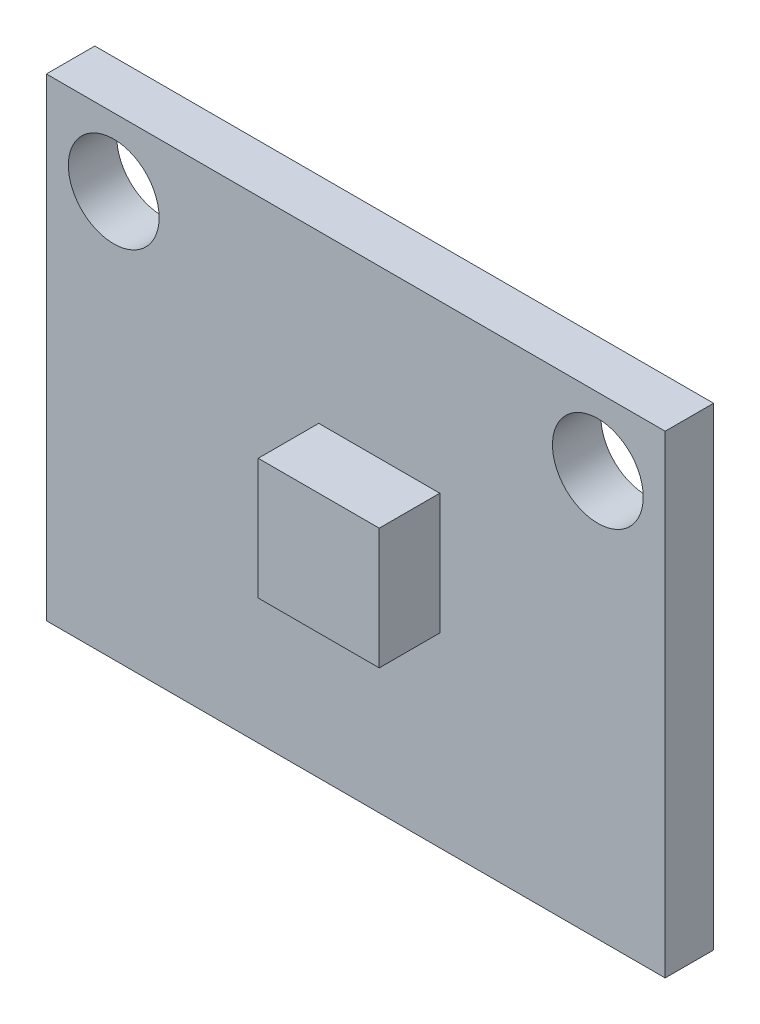
ISO-10303-21;
HEADER;
FILE_DESCRIPTION(('STEP AP214'),'2;1');
FILE_NAME('part.step','',(''),(''),'','','');
FILE_SCHEMA(('AUTOMOTIVE_DESIGN { 1 0 10303 214 1 1 1 1 }'));
ENDSEC;
DATA;
#1=APPLICATION_CONTEXT('core data for automotive mechanical design processes');
#2=APPLICATION_PROTOCOL_DEFINITION('international standard','automotive_design',2000,#1);
#3=PRODUCT_CONTEXT('',#1,'mechanical');
#4=PRODUCT('Part','Part','',(#3));
#5=PRODUCT_RELATED_PRODUCT_CATEGORY('part','',(#4));
#6=PRODUCT_DEFINITION_FORMATION('','',#4);
#7=PRODUCT_DEFINITION_CONTEXT('part definition',#1,'design');
#8=PRODUCT_DEFINITION('design','',#6,#7);
#9=PRODUCT_DEFINITION_SHAPE('','',#8);
#10=(LENGTH_UNIT() NAMED_UNIT(*) SI_UNIT(.MILLI.,.METRE.));
#11=(NAMED_UNIT(*) PLANE_ANGLE_UNIT() SI_UNIT($,.RADIAN.));
#12=(NAMED_UNIT(*) SI_UNIT($,.STERADIAN.) SOLID_ANGLE_UNIT());
#13=UNCERTAINTY_MEASURE_WITH_UNIT(LENGTH_MEASURE(1.E-05),#10,'distance_accuracy_value','');
#14=(GEOMETRIC_REPRESENTATION_CONTEXT(3) GLOBAL_UNCERTAINTY_ASSIGNED_CONTEXT((#13)) GLOBAL_UNIT_ASSIGNED_CONTEXT((#10,
#11,#12)) REPRESENTATION_CONTEXT('',''));
#15=CARTESIAN_POINT('',(0.,0.,0.));
#16=DIRECTION('',(0.,0.,1.));
#17=DIRECTION('',(1.,0.,0.));
#18=AXIS2_PLACEMENT_3D('',#15,#16,#17);
#19=CARTESIAN_POINT('',(-1.22499999999983,2.32500000000008,3.6));
#20=DIRECTION('',(1.,0.,0.));
#21=DIRECTION('',(0.,1.,0.));
#22=AXIS2_PLACEMENT_3D('',#19,#20,#21);
#23=PLANE('',#22);
#24=DIRECTION('',(0.,-1.,0.));
#25=VECTOR('',#24,1.);
#26=CARTESIAN_POINT('',(-1.22499999999983,2.32500000000008,1.6));
#27=LINE('',#26,#25);
#28=CARTESIAN_POINT('',(-1.22499999999983,2.32500000000008,1.6));
#29=VERTEX_POINT('',#28);
#30=CARTESIAN_POINT('',(-1.22499999999983,-1.67499999999992,1.6));
#31=VERTEX_POINT('',#30);
#32=EDGE_CURVE('E115',#29,#31,#27,.T.);
#33=ORIENTED_EDGE('',*,*,#32,.T.);
#34=DIRECTION('',(0.,0.,-1.));
#35=VECTOR('',#34,1.);
#36=CARTESIAN_POINT('',(-1.22499999999983,-1.67499999999992,3.6));
#37=LINE('',#36,#35);
#38=CARTESIAN_POINT('',(-1.22499999999983,-1.67499999999992,3.6));
#39=VERTEX_POINT('',#38);
#40=EDGE_CURVE('E12',#39,#31,#37,.T.);
#41=ORIENTED_EDGE('',*,*,#40,.F.);
#42=DIRECTION('',(0.,-1.,0.));
#43=VECTOR('',#42,1.);
#44=CARTESIAN_POINT('',(-1.22499999999983,2.32500000000008,3.6));
#45=LINE('',#44,#43);
#46=CARTESIAN_POINT('',(-1.22499999999983,2.32500000000008,3.6));
#47=VERTEX_POINT('',#46);
#48=EDGE_CURVE('E99',#47,#39,#45,.T.);
#49=ORIENTED_EDGE('',*,*,#48,.F.);
#50=DIRECTION('',(0.,0.,-1.));
#51=VECTOR('',#50,1.);
#52=CARTESIAN_POINT('',(-1.22499999999983,2.32500000000008,3.6));
#53=LINE('',#52,#51);
#54=EDGE_CURVE('E107',#47,#29,#53,.T.);
#55=ORIENTED_EDGE('',*,*,#54,.T.);
#56=EDGE_LOOP('',(#33,#41,#49,#55));
#57=FACE_BOUND('',#56,.T.);
#58=ADVANCED_FACE('F47',(#57),#23,.F.);
#59=CARTESIAN_POINT('',(2.77500000000017,-1.67499999999992,3.6));
#60=DIRECTION('',(0.,1.,0.));
#61=DIRECTION('',(-1.,0.,0.));
#62=AXIS2_PLACEMENT_3D('',#59,#60,#61);
#63=PLANE('',#62);
#64=DIRECTION('',(1.,0.,0.));
#65=VECTOR('',#64,1.);
#66=CARTESIAN_POINT('',(2.77500000000017,-1.67499999999992,1.6));
#67=LINE('',#66,#65);
#68=CARTESIAN_POINT('',(2.77500000000017,-1.67499999999992,1.6));
#69=VERTEX_POINT('',#68);
#70=EDGE_CURVE('E102',#31,#69,#67,.T.);
#71=ORIENTED_EDGE('',*,*,#70,.T.);
#72=DIRECTION('',(0.,0.,-1.));
#73=VECTOR('',#72,1.);
#74=CARTESIAN_POINT('',(2.77500000000017,-1.67499999999992,3.6));
#75=LINE('',#74,#73);
#76=CARTESIAN_POINT('',(2.77500000000017,-1.67499999999992,3.6));
#77=VERTEX_POINT('',#76);
#78=EDGE_CURVE('E60',#77,#69,#75,.T.);
#79=ORIENTED_EDGE('',*,*,#78,.F.);
#80=DIRECTION('',(1.,0.,0.));
#81=VECTOR('',#80,1.);
#82=CARTESIAN_POINT('',(2.77500000000017,-1.67499999999992,3.6));
#83=LINE('',#82,#81);
#84=EDGE_CURVE('E92',#39,#77,#83,.T.);
#85=ORIENTED_EDGE('',*,*,#84,.F.);
#86=ORIENTED_EDGE('',*,*,#40,.T.);
#87=EDGE_LOOP('',(#71,#79,#85,#86));
#88=FACE_BOUND('',#87,.T.);
#89=ADVANCED_FACE('F103',(#88),#63,.F.);
#90=CARTESIAN_POINT('',(2.77500000000017,2.32500000000008,3.6));
#91=DIRECTION('',(-1.,0.,0.));
#92=DIRECTION('',(0.,-1.,0.));
#93=AXIS2_PLACEMENT_3D('',#90,#91,#92);
#94=PLANE('',#93);
#95=DIRECTION('',(0.,1.,0.));
#96=VECTOR('',#95,1.);
#97=CARTESIAN_POINT('',(2.77500000000017,2.32500000000008,1.6));
#98=LINE('',#97,#96);
#99=CARTESIAN_POINT('',(2.77500000000017,2.32500000000008,1.6));
#100=VERTEX_POINT('',#99);
#101=EDGE_CURVE('E85',#69,#100,#98,.T.);
#102=ORIENTED_EDGE('',*,*,#101,.T.);
#103=DIRECTION('',(0.,0.,-1.));
#104=VECTOR('',#103,1.);
#105=CARTESIAN_POINT('',(2.77500000000017,2.32500000000008,3.6));
#106=LINE('',#105,#104);
#107=CARTESIAN_POINT('',(2.77500000000017,2.32500000000008,3.6));
#108=VERTEX_POINT('',#107);
#109=EDGE_CURVE('E104',#108,#100,#106,.T.);
#110=ORIENTED_EDGE('',*,*,#109,.F.);
#111=DIRECTION('',(0.,1.,0.));
#112=VECTOR('',#111,1.);
#113=CARTESIAN_POINT('',(2.77500000000017,2.32500000000008,3.6));
#114=LINE('',#113,#112);
#115=EDGE_CURVE('E98',#77,#108,#114,.T.);
#116=ORIENTED_EDGE('',*,*,#115,.F.);
#117=ORIENTED_EDGE('',*,*,#78,.T.);
#118=EDGE_LOOP('',(#102,#110,#116,#117));
#119=FACE_BOUND('',#118,.T.);
#120=ADVANCED_FACE('F106',(#119),#94,.F.);
#121=CARTESIAN_POINT('',(2.77500000000017,2.32500000000008,3.6));
#122=DIRECTION('',(0.,-1.,0.));
#123=DIRECTION('',(0.,0.,-1.));
#124=AXIS2_PLACEMENT_3D('',#121,#122,#123);
#125=PLANE('',#124);
#126=DIRECTION('',(-1.,0.,0.));
#127=VECTOR('',#126,1.);
#128=CARTESIAN_POINT('',(2.77500000000017,2.32500000000008,1.6));
#129=LINE('',#128,#127);
#130=EDGE_CURVE('E86',#100,#29,#129,.T.);
#131=ORIENTED_EDGE('',*,*,#130,.T.);
#132=ORIENTED_EDGE('',*,*,#54,.F.);
#133=DIRECTION('',(-1.,0.,0.));
#134=VECTOR('',#133,1.);
#135=CARTESIAN_POINT('',(2.77500000000017,2.32500000000008,3.6));
#136=LINE('',#135,#134);
#137=EDGE_CURVE('E63',#108,#47,#136,.T.);
#138=ORIENTED_EDGE('',*,*,#137,.F.);
#139=ORIENTED_EDGE('',*,*,#109,.T.);
#140=EDGE_LOOP('',(#131,#132,#138,#139));
#141=FACE_BOUND('',#140,.T.);
#142=ADVANCED_FACE('F116',(#141),#125,.F.);
#143=CARTESIAN_POINT('',(0.,0.,3.6));
#144=DIRECTION('',(0.,0.,-1.));
#145=DIRECTION('',(-1.,0.,0.));
#146=AXIS2_PLACEMENT_3D('',#143,#144,#145);
#147=PLANE('',#146);
#148=ORIENTED_EDGE('',*,*,#48,.T.);
#149=ORIENTED_EDGE('',*,*,#84,.T.);
#150=ORIENTED_EDGE('',*,*,#115,.T.);
#151=ORIENTED_EDGE('',*,*,#137,.T.);
#152=EDGE_LOOP('',(#148,#149,#150,#151));
#153=FACE_BOUND('',#152,.T.);
#154=ADVANCED_FACE('F96',(#153),#147,.F.);
#155=CARTESIAN_POINT('',(0.,0.,1.6));
#156=DIRECTION('',(0.,0.,-1.));
#157=DIRECTION('',(-1.,0.,0.));
#158=AXIS2_PLACEMENT_3D('',#155,#156,#157);
#159=PLANE('',#158);
#160=ORIENTED_EDGE('',*,*,#32,.F.);
#161=ORIENTED_EDGE('',*,*,#130,.F.);
#162=ORIENTED_EDGE('',*,*,#101,.F.);
#163=ORIENTED_EDGE('',*,*,#70,.F.);
#164=EDGE_LOOP('',(#160,#161,#162,#163));
#165=FACE_BOUND('',#164,.T.);
#166=ADVANCED_FACE('F125',(#165),#159,.T.);
#167=CLOSED_SHELL('',(#58,#89,#120,#142,#154,#166));
#168=MANIFOLD_SOLID_BREP('B2',#167);
#169=CARTESIAN_POINT('',(0.,0.,1.6));
#170=DIRECTION('',(0.,0.,-1.));
#171=DIRECTION('',(-1.,0.,0.));
#172=AXIS2_PLACEMENT_3D('',#169,#170,#171);
#173=PLANE('',#172);
#174=DIRECTION('',(0.,1.,0.));
#175=VECTOR('',#174,1.);
#176=CARTESIAN_POINT('',(10.2249999999998,-7.82499999999992,1.6));
#177=LINE('',#176,#175);
#178=CARTESIAN_POINT('',(10.2249999999998,-7.82499999999992,1.6));
#179=VERTEX_POINT('',#178);
#180=CARTESIAN_POINT('',(10.2250000000002,7.82500000000008,1.6));
#181=VERTEX_POINT('',#180);
#182=EDGE_CURVE('E223',#179,#181,#177,.T.);
#183=ORIENTED_EDGE('',*,*,#182,.T.);
#184=DIRECTION('',(-1.,0.,0.));
#185=VECTOR('',#184,1.);
#186=CARTESIAN_POINT('',(-10.2249999999998,7.82500000000008,1.6));
#187=LINE('',#186,#185);
#188=CARTESIAN_POINT('',(-10.2249999999998,7.82500000000008,1.6));
#189=VERTEX_POINT('',#188);
#190=EDGE_CURVE('E219',#181,#189,#187,.T.);
#191=ORIENTED_EDGE('',*,*,#190,.T.);
#192=DIRECTION('',(0.,-1.,0.));
#193=VECTOR('',#192,1.);
#194=CARTESIAN_POINT('',(-10.2249999999998,-7.82499999999986,1.6));
#195=LINE('',#194,#193);
#196=CARTESIAN_POINT('',(-10.2249999999998,-7.82499999999986,1.6));
#197=VERTEX_POINT('',#196);
#198=EDGE_CURVE('E224',#189,#197,#195,.T.);
#199=ORIENTED_EDGE('',*,*,#198,.T.);
#200=DIRECTION('',(1.,0.,0.));
#201=VECTOR('',#200,1.);
#202=CARTESIAN_POINT('',(-10.2249999999998,-7.82499999999986,1.6));
#203=LINE('',#202,#201);
#204=EDGE_CURVE('E188',#197,#179,#203,.T.);
#205=ORIENTED_EDGE('',*,*,#204,.T.);
#206=EDGE_LOOP('',(#183,#191,#199,#205));
#207=FACE_BOUND('',#206,.T.);
#208=CARTESIAN_POINT('',(-8.,5.57500000000008,1.6));
#209=DIRECTION('',(0.,0.,1.));
#210=DIRECTION('',(1.,0.,0.));
#211=AXIS2_PLACEMENT_3D('',#208,#209,#210);
#212=CIRCLE('',#211,1.5);
#213=CARTESIAN_POINT('',(-6.5,5.57500000000008,1.6));
#214=VERTEX_POINT('',#213);
#215=EDGE_CURVE('E238',#214,#214,#212,.T.);
#216=ORIENTED_EDGE('',*,*,#215,.F.);
#217=EDGE_LOOP('',(#216));
#218=FACE_BOUND('',#217,.T.);
#219=CARTESIAN_POINT('',(8.,5.57500000000008,1.6));
#220=DIRECTION('',(0.,0.,1.));
#221=DIRECTION('',(1.,0.,0.));
#222=AXIS2_PLACEMENT_3D('',#219,#220,#221);
#223=CIRCLE('',#222,1.5);
#224=CARTESIAN_POINT('',(9.5,5.57500000000008,1.6));
#225=VERTEX_POINT('',#224);
#226=EDGE_CURVE('E254',#225,#225,#223,.T.);
#227=ORIENTED_EDGE('',*,*,#226,.F.);
#228=EDGE_LOOP('',(#227));
#229=FACE_BOUND('',#228,.T.);
#230=ADVANCED_FACE('F174',(#207,#218,#229),#173,.F.);
#231=CARTESIAN_POINT('',(0.,0.,0.));
#232=DIRECTION('',(0.,0.,-1.));
#233=DIRECTION('',(-1.,0.,0.));
#234=AXIS2_PLACEMENT_3D('',#231,#232,#233);
#235=PLANE('',#234);
#236=CARTESIAN_POINT('',(-8.,5.57500000000008,0.));
#237=DIRECTION('',(0.,0.,1.));
#238=DIRECTION('',(1.,0.,0.));
#239=AXIS2_PLACEMENT_3D('',#236,#237,#238);
#240=CIRCLE('',#239,1.5);
#241=CARTESIAN_POINT('',(-6.5,5.57500000000008,0.));
#242=VERTEX_POINT('',#241);
#243=EDGE_CURVE('E252',#242,#242,#240,.T.);
#244=ORIENTED_EDGE('',*,*,#243,.T.);
#245=EDGE_LOOP('',(#244));
#246=FACE_BOUND('',#245,.T.);
#247=DIRECTION('',(0.,1.,0.));
#248=VECTOR('',#247,1.);
#249=CARTESIAN_POINT('',(10.2249999999998,-7.82499999999992,0.));
#250=LINE('',#249,#248);
#251=CARTESIAN_POINT('',(10.2249999999998,-7.82499999999992,0.));
#252=VERTEX_POINT('',#251);
#253=CARTESIAN_POINT('',(10.2250000000002,7.82500000000008,0.));
#254=VERTEX_POINT('',#253);
#255=EDGE_CURVE('E240',#252,#254,#250,.T.);
#256=ORIENTED_EDGE('',*,*,#255,.F.);
#257=DIRECTION('',(1.,0.,0.));
#258=VECTOR('',#257,1.);
#259=CARTESIAN_POINT('',(-10.2249999999998,-7.82499999999986,0.));
#260=LINE('',#259,#258);
#261=CARTESIAN_POINT('',(-10.2249999999998,-7.82499999999986,0.));
#262=VERTEX_POINT('',#261);
#263=EDGE_CURVE('E213',#262,#252,#260,.T.);
#264=ORIENTED_EDGE('',*,*,#263,.F.);
#265=DIRECTION('',(0.,-1.,0.));
#266=VECTOR('',#265,1.);
#267=CARTESIAN_POINT('',(-10.2249999999998,-7.82499999999986,0.));
#268=LINE('',#267,#266);
#269=CARTESIAN_POINT('',(-10.2249999999998,7.82500000000008,0.));
#270=VERTEX_POINT('',#269);
#271=EDGE_CURVE('E210',#270,#262,#268,.T.);
#272=ORIENTED_EDGE('',*,*,#271,.F.);
#273=DIRECTION('',(-1.,0.,0.));
#274=VECTOR('',#273,1.);
#275=CARTESIAN_POINT('',(-10.2249999999998,7.82500000000008,0.));
#276=LINE('',#275,#274);
#277=EDGE_CURVE('E226',#254,#270,#276,.T.);
#278=ORIENTED_EDGE('',*,*,#277,.F.);
#279=EDGE_LOOP('',(#256,#264,#272,#278));
#280=FACE_BOUND('',#279,.T.);
#281=CARTESIAN_POINT('',(8.,5.57500000000008,0.));
#282=DIRECTION('',(0.,0.,1.));
#283=DIRECTION('',(1.,0.,0.));
#284=AXIS2_PLACEMENT_3D('',#281,#282,#283);
#285=CIRCLE('',#284,1.5);
#286=CARTESIAN_POINT('',(9.5,5.57500000000008,0.));
#287=VERTEX_POINT('',#286);
#288=EDGE_CURVE('E256',#287,#287,#285,.T.);
#289=ORIENTED_EDGE('',*,*,#288,.T.);
#290=EDGE_LOOP('',(#289));
#291=FACE_BOUND('',#290,.T.);
#292=ADVANCED_FACE('F246',(#246,#280,#291),#235,.T.);
#293=CARTESIAN_POINT('',(10.2249999999998,-7.82499999999992,1.6));
#294=DIRECTION('',(-1.,0.,0.));
#295=DIRECTION('',(0.,-1.,0.));
#296=AXIS2_PLACEMENT_3D('',#293,#294,#295);
#297=PLANE('',#296);
#298=ORIENTED_EDGE('',*,*,#255,.T.);
#299=DIRECTION('',(0.,0.,-1.));
#300=VECTOR('',#299,1.);
#301=CARTESIAN_POINT('',(10.2250000000002,7.82500000000008,1.6));
#302=LINE('',#301,#300);
#303=EDGE_CURVE('E50',#181,#254,#302,.T.);
#304=ORIENTED_EDGE('',*,*,#303,.F.);
#305=ORIENTED_EDGE('',*,*,#182,.F.);
#306=DIRECTION('',(0.,0.,-1.));
#307=VECTOR('',#306,1.);
#308=CARTESIAN_POINT('',(10.2249999999998,-7.82499999999992,1.6));
#309=LINE('',#308,#307);
#310=EDGE_CURVE('E231',#179,#252,#309,.T.);
#311=ORIENTED_EDGE('',*,*,#310,.T.);
#312=EDGE_LOOP('',(#298,#304,#305,#311));
#313=FACE_BOUND('',#312,.T.);
#314=ADVANCED_FACE('F173',(#313),#297,.F.);
#315=CARTESIAN_POINT('',(-10.2249999999998,7.82500000000008,1.6));
#316=DIRECTION('',(0.,-1.,0.));
#317=DIRECTION('',(0.,0.,-1.));
#318=AXIS2_PLACEMENT_3D('',#315,#316,#317);
#319=PLANE('',#318);
#320=ORIENTED_EDGE('',*,*,#277,.T.);
#321=DIRECTION('',(0.,0.,-1.));
#322=VECTOR('',#321,1.);
#323=CARTESIAN_POINT('',(-10.2249999999998,7.82500000000008,1.6));
#324=LINE('',#323,#322);
#325=EDGE_CURVE('E185',#189,#270,#324,.T.);
#326=ORIENTED_EDGE('',*,*,#325,.F.);
#327=ORIENTED_EDGE('',*,*,#190,.F.);
#328=ORIENTED_EDGE('',*,*,#303,.T.);
#329=EDGE_LOOP('',(#320,#326,#327,#328));
#330=FACE_BOUND('',#329,.T.);
#331=ADVANCED_FACE('F229',(#330),#319,.F.);
#332=CARTESIAN_POINT('',(-10.2249999999998,-7.82499999999986,1.6));
#333=DIRECTION('',(1.,0.,0.));
#334=DIRECTION('',(0.,0.,-1.));
#335=AXIS2_PLACEMENT_3D('',#332,#333,#334);
#336=PLANE('',#335);
#337=ORIENTED_EDGE('',*,*,#271,.T.);
#338=DIRECTION('',(0.,0.,-1.));
#339=VECTOR('',#338,1.);
#340=CARTESIAN_POINT('',(-10.2249999999998,-7.82499999999986,1.6));
#341=LINE('',#340,#339);
#342=EDGE_CURVE('E228',#197,#262,#341,.T.);
#343=ORIENTED_EDGE('',*,*,#342,.F.);
#344=ORIENTED_EDGE('',*,*,#198,.F.);
#345=ORIENTED_EDGE('',*,*,#325,.T.);
#346=EDGE_LOOP('',(#337,#343,#344,#345));
#347=FACE_BOUND('',#346,.T.);
#348=ADVANCED_FACE('F233',(#347),#336,.F.);
#349=CARTESIAN_POINT('',(-10.2249999999998,-7.82499999999986,1.6));
#350=DIRECTION('',(0.,1.,0.));
#351=DIRECTION('',(-1.,0.,0.));
#352=AXIS2_PLACEMENT_3D('',#349,#350,#351);
#353=PLANE('',#352);
#354=ORIENTED_EDGE('',*,*,#263,.T.);
#355=ORIENTED_EDGE('',*,*,#310,.F.);
#356=ORIENTED_EDGE('',*,*,#204,.F.);
#357=ORIENTED_EDGE('',*,*,#342,.T.);
#358=EDGE_LOOP('',(#354,#355,#356,#357));
#359=FACE_BOUND('',#358,.T.);
#360=ADVANCED_FACE('F243',(#359),#353,.F.);
#361=CARTESIAN_POINT('',(-8.,5.57500000000008,1.6));
#362=DIRECTION('',(0.,0.,-1.));
#363=DIRECTION('',(-1.,0.,0.));
#364=AXIS2_PLACEMENT_3D('',#361,#362,#363);
#365=CYLINDRICAL_SURFACE('',#364,1.5);
#366=ORIENTED_EDGE('',*,*,#215,.T.);
#367=EDGE_LOOP('',(#366));
#368=FACE_BOUND('',#367,.T.);
#369=ORIENTED_EDGE('',*,*,#243,.F.);
#370=EDGE_LOOP('',(#369));
#371=FACE_BOUND('',#370,.T.);
#372=ADVANCED_FACE('F274',(#368,#371),#365,.F.);
#373=CARTESIAN_POINT('',(8.,5.57500000000008,1.6));
#374=DIRECTION('',(0.,0.,-1.));
#375=DIRECTION('',(-1.,0.,0.));
#376=AXIS2_PLACEMENT_3D('',#373,#374,#375);
#377=CYLINDRICAL_SURFACE('',#376,1.5);
#378=ORIENTED_EDGE('',*,*,#226,.T.);
#379=EDGE_LOOP('',(#378));
#380=FACE_BOUND('',#379,.T.);
#381=ORIENTED_EDGE('',*,*,#288,.F.);
#382=EDGE_LOOP('',(#381));
#383=FACE_BOUND('',#382,.T.);
#384=ADVANCED_FACE('F262',(#380,#383),#377,.F.);
#385=CLOSED_SHELL('',(#230,#292,#314,#331,#348,#360,#372,#384));
#386=MANIFOLD_SOLID_BREP('B6',#385);
#387=ADVANCED_BREP_SHAPE_REPRESENTATION('',(#18,#168,#386),#14);
#388=SHAPE_DEFINITION_REPRESENTATION(#9,#387);
ENDSEC;
END-ISO-10303-21;
